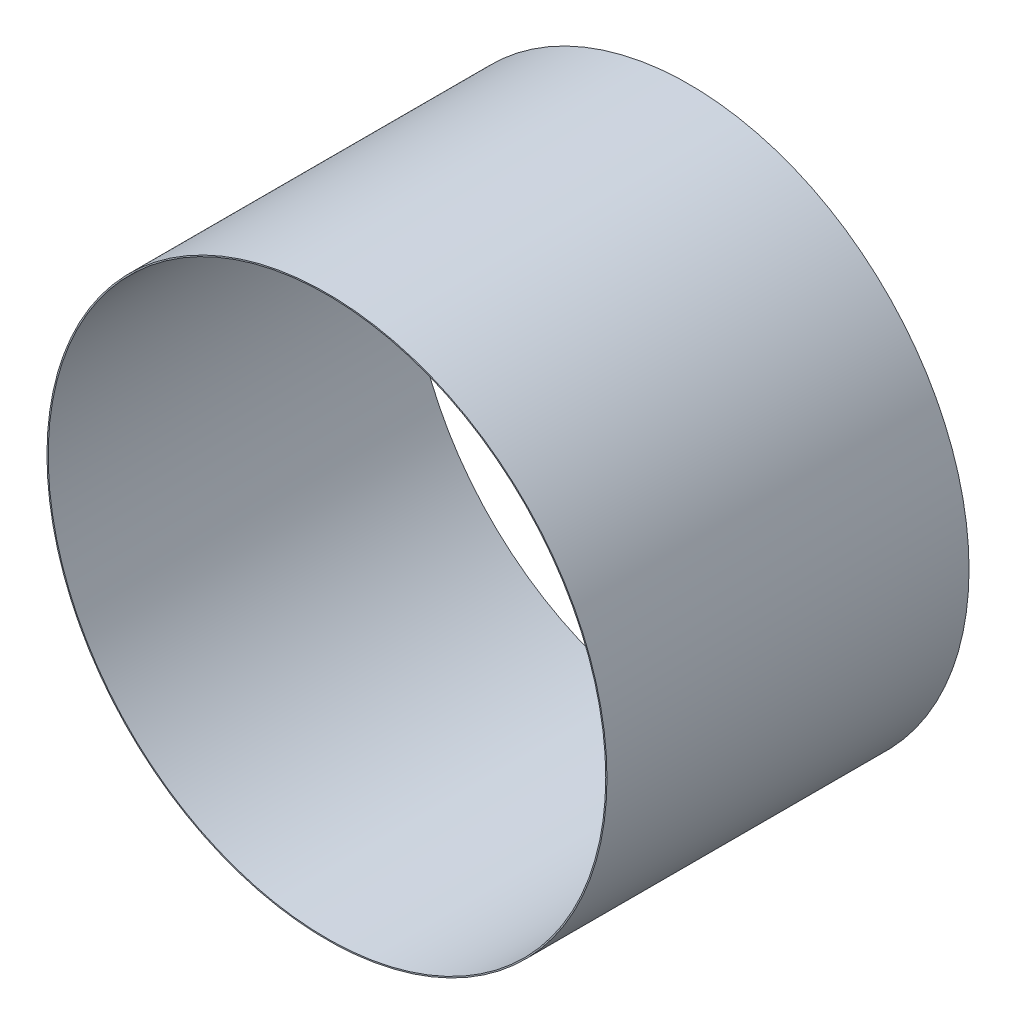
ISO-10303-21;
HEADER;
FILE_DESCRIPTION(('STEP AP214'),'2;1');
FILE_NAME('part.step','',(''),(''),'','','');
FILE_SCHEMA(('AUTOMOTIVE_DESIGN { 1 0 10303 214 1 1 1 1 }'));
ENDSEC;
DATA;
#1=APPLICATION_CONTEXT('core data for automotive mechanical design processes');
#2=APPLICATION_PROTOCOL_DEFINITION('international standard','automotive_design',2000,#1);
#3=PRODUCT_CONTEXT('',#1,'mechanical');
#4=PRODUCT('Part','Part','',(#3));
#5=PRODUCT_RELATED_PRODUCT_CATEGORY('part','',(#4));
#6=PRODUCT_DEFINITION_FORMATION('','',#4);
#7=PRODUCT_DEFINITION_CONTEXT('part definition',#1,'design');
#8=PRODUCT_DEFINITION('design','',#6,#7);
#9=PRODUCT_DEFINITION_SHAPE('','',#8);
#10=(LENGTH_UNIT() NAMED_UNIT(*) SI_UNIT(.MILLI.,.METRE.));
#11=(NAMED_UNIT(*) PLANE_ANGLE_UNIT() SI_UNIT($,.RADIAN.));
#12=(NAMED_UNIT(*) SI_UNIT($,.STERADIAN.) SOLID_ANGLE_UNIT());
#13=UNCERTAINTY_MEASURE_WITH_UNIT(LENGTH_MEASURE(1.E-05),#10,'distance_accuracy_value','');
#14=(GEOMETRIC_REPRESENTATION_CONTEXT(3) GLOBAL_UNCERTAINTY_ASSIGNED_CONTEXT((#13)) GLOBAL_UNIT_ASSIGNED_CONTEXT((#10,
#11,#12)) REPRESENTATION_CONTEXT('',''));
#15=CARTESIAN_POINT('',(0.,0.,0.));
#16=DIRECTION('',(0.,0.,1.));
#17=DIRECTION('',(1.,0.,0.));
#18=AXIS2_PLACEMENT_3D('',#15,#16,#17);
#19=CARTESIAN_POINT('',(3.82033071844035E-09,-9.72969438350901E-07,0.599999999999992));
#20=DIRECTION('',(0.,0.,-1.));
#21=DIRECTION('',(0.,-1.,0.));
#22=AXIS2_PLACEMENT_3D('',#19,#20,#21);
#23=PLANE('',#22);
#24=CARTESIAN_POINT('',(3.82033127355186E-09,-9.72969438906013E-07,0.599999999999992));
#25=DIRECTION('',(0.,0.,-1.));
#26=DIRECTION('',(1.,0.,0.));
#27=AXIS2_PLACEMENT_3D('',#24,#25,#26);
#28=CIRCLE('',#27,5.775);
#29=CARTESIAN_POINT('',(5.77500000382033,-9.72969438906013E-07,0.599999999999992));
#30=VERTEX_POINT('',#29);
#31=EDGE_CURVE('E31',#30,#30,#28,.T.);
#32=ORIENTED_EDGE('',*,*,#31,.T.);
#33=EDGE_LOOP('',(#32));
#34=FACE_BOUND('',#33,.T.);
#35=CARTESIAN_POINT('',(3.82033127355186E-09,-9.72969438906013E-07,0.599999999999992));
#36=DIRECTION('',(0.,0.,-1.));
#37=DIRECTION('',(1.,0.,0.));
#38=AXIS2_PLACEMENT_3D('',#35,#36,#37);
#39=CIRCLE('',#38,5.8);
#40=CARTESIAN_POINT('',(5.80000000382033,-9.72969438906013E-07,0.599999999999992));
#41=VERTEX_POINT('',#40);
#42=EDGE_CURVE('E10',#41,#41,#39,.T.);
#43=ORIENTED_EDGE('',*,*,#42,.F.);
#44=EDGE_LOOP('',(#43));
#45=FACE_BOUND('',#44,.T.);
#46=ADVANCED_FACE('F15',(#34,#45),#23,.F.);
#47=CARTESIAN_POINT('',(3.82033071844035E-09,-9.72969438350902E-07,-6.9));
#48=DIRECTION('',(0.,0.,-1.));
#49=DIRECTION('',(0.,-1.,0.));
#50=AXIS2_PLACEMENT_3D('',#47,#48,#49);
#51=PLANE('',#50);
#52=CARTESIAN_POINT('',(3.82033127355186E-09,-9.72969438906013E-07,-6.9));
#53=DIRECTION('',(0.,0.,1.));
#54=DIRECTION('',(1.,0.,0.));
#55=AXIS2_PLACEMENT_3D('',#52,#53,#54);
#56=CIRCLE('',#55,5.775);
#57=CARTESIAN_POINT('',(5.77500000382033,-9.72969438906013E-07,-6.9));
#58=VERTEX_POINT('',#57);
#59=EDGE_CURVE('E38',#58,#58,#56,.T.);
#60=ORIENTED_EDGE('',*,*,#59,.T.);
#61=EDGE_LOOP('',(#60));
#62=FACE_BOUND('',#61,.T.);
#63=CARTESIAN_POINT('',(3.82033127355186E-09,-9.72969438906013E-07,-6.9));
#64=DIRECTION('',(0.,0.,-1.));
#65=DIRECTION('',(1.,0.,0.));
#66=AXIS2_PLACEMENT_3D('',#63,#64,#65);
#67=CIRCLE('',#66,5.8);
#68=CARTESIAN_POINT('',(5.80000000382033,-9.72969438906013E-07,-6.9));
#69=VERTEX_POINT('',#68);
#70=EDGE_CURVE('E22',#69,#69,#67,.T.);
#71=ORIENTED_EDGE('',*,*,#70,.T.);
#72=EDGE_LOOP('',(#71));
#73=FACE_BOUND('',#72,.T.);
#74=ADVANCED_FACE('F47',(#62,#73),#51,.T.);
#75=CARTESIAN_POINT('',(3.82033127355186E-09,-9.72969438906013E-07,0.599999999999992));
#76=DIRECTION('',(0.,0.,-1.));
#77=DIRECTION('',(1.,0.,0.));
#78=AXIS2_PLACEMENT_3D('',#75,#76,#77);
#79=CYLINDRICAL_SURFACE('',#78,5.8);
#80=ORIENTED_EDGE('',*,*,#42,.T.);
#81=EDGE_LOOP('',(#80));
#82=FACE_BOUND('',#81,.T.);
#83=ORIENTED_EDGE('',*,*,#70,.F.);
#84=EDGE_LOOP('',(#83));
#85=FACE_BOUND('',#84,.T.);
#86=ADVANCED_FACE('F51',(#82,#85),#79,.T.);
#87=CARTESIAN_POINT('',(3.82033127355186E-09,-9.72969438906013E-07,0.599999999999992));
#88=DIRECTION('',(0.,0.,-1.));
#89=DIRECTION('',(1.,0.,0.));
#90=AXIS2_PLACEMENT_3D('',#87,#88,#89);
#91=CYLINDRICAL_SURFACE('',#90,5.775);
#92=ORIENTED_EDGE('',*,*,#31,.F.);
#93=EDGE_LOOP('',(#92));
#94=FACE_BOUND('',#93,.T.);
#95=ORIENTED_EDGE('',*,*,#59,.F.);
#96=EDGE_LOOP('',(#95));
#97=FACE_BOUND('',#96,.T.);
#98=ADVANCED_FACE('F49',(#94,#97),#91,.F.);
#99=CLOSED_SHELL('',(#46,#74,#86,#98));
#100=MANIFOLD_SOLID_BREP('B1',#99);
#101=ADVANCED_BREP_SHAPE_REPRESENTATION('',(#18,#100),#14);
#102=SHAPE_DEFINITION_REPRESENTATION(#9,#101);
ENDSEC;
END-ISO-10303-21;
